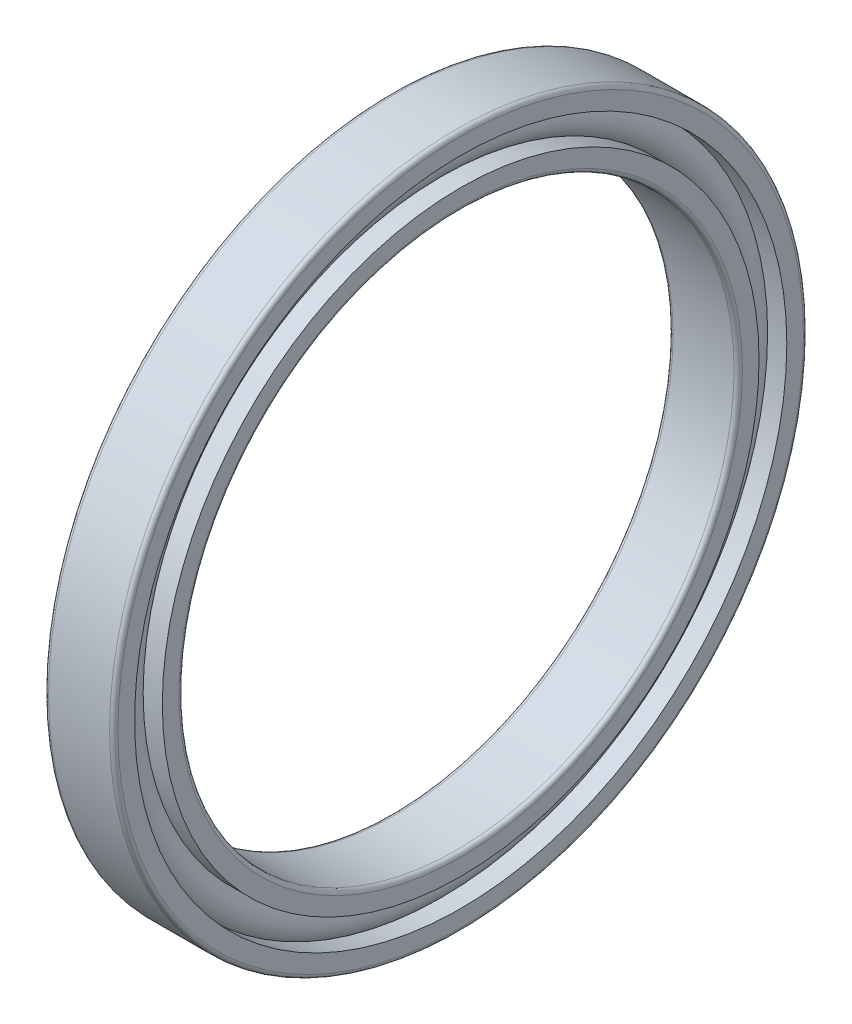
ISO-10303-21;
HEADER;
FILE_DESCRIPTION(('STEP AP214'),'2;1');
FILE_NAME('part.step','',(''),(''),'','','');
FILE_SCHEMA(('AUTOMOTIVE_DESIGN { 1 0 10303 214 1 1 1 1 }'));
ENDSEC;
DATA;
#1=APPLICATION_CONTEXT('core data for automotive mechanical design processes');
#2=APPLICATION_PROTOCOL_DEFINITION('international standard','automotive_design',2000,#1);
#3=PRODUCT_CONTEXT('',#1,'mechanical');
#4=PRODUCT('Part','Part','',(#3));
#5=PRODUCT_RELATED_PRODUCT_CATEGORY('part','',(#4));
#6=PRODUCT_DEFINITION_FORMATION('','',#4);
#7=PRODUCT_DEFINITION_CONTEXT('part definition',#1,'design');
#8=PRODUCT_DEFINITION('design','',#6,#7);
#9=PRODUCT_DEFINITION_SHAPE('','',#8);
#10=(LENGTH_UNIT() NAMED_UNIT(*) SI_UNIT(.MILLI.,.METRE.));
#11=(NAMED_UNIT(*) PLANE_ANGLE_UNIT() SI_UNIT($,.RADIAN.));
#12=(NAMED_UNIT(*) SI_UNIT($,.STERADIAN.) SOLID_ANGLE_UNIT());
#13=UNCERTAINTY_MEASURE_WITH_UNIT(LENGTH_MEASURE(1.E-05),#10,'distance_accuracy_value','');
#14=(GEOMETRIC_REPRESENTATION_CONTEXT(3) GLOBAL_UNCERTAINTY_ASSIGNED_CONTEXT((#13)) GLOBAL_UNIT_ASSIGNED_CONTEXT((#10,
#11,#12)) REPRESENTATION_CONTEXT('',''));
#15=CARTESIAN_POINT('',(0.,0.,0.));
#16=DIRECTION('',(0.,0.,1.));
#17=DIRECTION('',(1.,0.,0.));
#18=AXIS2_PLACEMENT_3D('',#15,#16,#17);
#19=CARTESIAN_POINT('',(0.,0.,0.));
#20=DIRECTION('',(-1.,0.,0.));
#21=DIRECTION('',(0.,0.,1.));
#22=AXIS2_PLACEMENT_3D('',#19,#20,#21);
#23=TOROIDAL_SURFACE('',#22,45.,3.);
#24=CARTESIAN_POINT('',(2.23606797749979,0.,0.));
#25=DIRECTION('',(-1.,0.,0.));
#26=DIRECTION('',(0.,0.,1.));
#27=AXIS2_PLACEMENT_3D('',#24,#25,#26);
#28=CIRCLE('',#27,47.);
#29=CARTESIAN_POINT('',(2.23606797749979,0.,47.));
#30=VERTEX_POINT('',#29);
#31=EDGE_CURVE('E38',#30,#30,#28,.F.);
#32=ORIENTED_EDGE('',*,*,#31,.T.);
#33=EDGE_LOOP('',(#32));
#34=FACE_BOUND('',#33,.T.);
#35=CARTESIAN_POINT('',(2.23606797749979,0.,0.));
#36=DIRECTION('',(-1.,0.,0.));
#37=DIRECTION('',(0.,0.,1.));
#38=AXIS2_PLACEMENT_3D('',#35,#36,#37);
#39=CIRCLE('',#38,43.);
#40=CARTESIAN_POINT('',(2.23606797749979,0.,43.));
#41=VERTEX_POINT('',#40);
#42=EDGE_CURVE('E10',#41,#41,#39,.T.);
#43=ORIENTED_EDGE('',*,*,#42,.T.);
#44=EDGE_LOOP('',(#43));
#45=FACE_BOUND('',#44,.T.);
#46=ADVANCED_FACE('F34',(#34,#45),#23,.T.);
#47=CARTESIAN_POINT('',(-20.6375,0.,0.));
#48=DIRECTION('',(1.,0.,0.));
#49=DIRECTION('',(0.,0.,-1.));
#50=AXIS2_PLACEMENT_3D('',#47,#48,#49);
#51=CYLINDRICAL_SURFACE('',#50,43.);
#52=CARTESIAN_POINT('',(5.,0.,0.));
#53=DIRECTION('',(1.,0.,0.));
#54=DIRECTION('',(0.,0.,-1.));
#55=AXIS2_PLACEMENT_3D('',#52,#53,#54);
#56=CIRCLE('',#55,43.);
#57=CARTESIAN_POINT('',(5.,0.,-43.));
#58=VERTEX_POINT('',#57);
#59=EDGE_CURVE('E47',#58,#58,#56,.T.);
#60=ORIENTED_EDGE('',*,*,#59,.F.);
#61=EDGE_LOOP('',(#60));
#62=FACE_BOUND('',#61,.T.);
#63=ORIENTED_EDGE('',*,*,#42,.F.);
#64=EDGE_LOOP('',(#63));
#65=FACE_BOUND('',#64,.T.);
#66=ADVANCED_FACE('F86',(#62,#65),#51,.T.);
#67=CARTESIAN_POINT('',(-20.6375,0.,0.));
#68=DIRECTION('',(1.,0.,0.));
#69=DIRECTION('',(0.,0.,-1.));
#70=AXIS2_PLACEMENT_3D('',#67,#68,#69);
#71=CYLINDRICAL_SURFACE('',#70,43.);
#72=CARTESIAN_POINT('',(-5.,0.,0.));
#73=DIRECTION('',(1.,0.,0.));
#74=DIRECTION('',(0.,0.,-1.));
#75=AXIS2_PLACEMENT_3D('',#72,#73,#74);
#76=CIRCLE('',#75,43.);
#77=CARTESIAN_POINT('',(-5.,0.,-43.));
#78=VERTEX_POINT('',#77);
#79=EDGE_CURVE('E56',#78,#78,#76,.T.);
#80=ORIENTED_EDGE('',*,*,#79,.T.);
#81=EDGE_LOOP('',(#80));
#82=FACE_BOUND('',#81,.T.);
#83=CARTESIAN_POINT('',(-2.23606797749979,0.,0.));
#84=DIRECTION('',(1.,0.,0.));
#85=DIRECTION('',(0.,0.,-1.));
#86=AXIS2_PLACEMENT_3D('',#83,#84,#85);
#87=CIRCLE('',#86,43.);
#88=CARTESIAN_POINT('',(-2.23606797749979,0.,-43.));
#89=VERTEX_POINT('',#88);
#90=EDGE_CURVE('E42',#89,#89,#87,.T.);
#91=ORIENTED_EDGE('',*,*,#90,.F.);
#92=EDGE_LOOP('',(#91));
#93=FACE_BOUND('',#92,.T.);
#94=ADVANCED_FACE('F89',(#82,#93),#71,.T.);
#95=CARTESIAN_POINT('',(5.,40.6,0.));
#96=DIRECTION('',(1.,0.,0.));
#97=DIRECTION('',(0.,0.,-1.));
#98=AXIS2_PLACEMENT_3D('',#95,#96,#97);
#99=PLANE('',#98);
#100=ORIENTED_EDGE('',*,*,#59,.T.);
#101=EDGE_LOOP('',(#100));
#102=FACE_BOUND('',#101,.T.);
#103=CARTESIAN_POINT('',(5.,0.,0.));
#104=DIRECTION('',(1.,0.,0.));
#105=DIRECTION('',(0.,0.,-1.));
#106=AXIS2_PLACEMENT_3D('',#103,#104,#105);
#107=CIRCLE('',#106,40.6);
#108=CARTESIAN_POINT('',(5.,0.,-40.6));
#109=VERTEX_POINT('',#108);
#110=EDGE_CURVE('E78',#109,#109,#107,.T.);
#111=ORIENTED_EDGE('',*,*,#110,.F.);
#112=EDGE_LOOP('',(#111));
#113=FACE_BOUND('',#112,.T.);
#114=ADVANCED_FACE('F83',(#102,#113),#99,.T.);
#115=CARTESIAN_POINT('',(4.4,0.,0.));
#116=DIRECTION('',(1.,0.,0.));
#117=DIRECTION('',(0.,0.,-1.));
#118=AXIS2_PLACEMENT_3D('',#115,#116,#117);
#119=TOROIDAL_SURFACE('',#118,40.6,0.600000000000002);
#120=ORIENTED_EDGE('',*,*,#110,.T.);
#121=EDGE_LOOP('',(#120));
#122=FACE_BOUND('',#121,.T.);
#123=CARTESIAN_POINT('',(4.4,0.,0.));
#124=DIRECTION('',(1.,0.,0.));
#125=DIRECTION('',(0.,0.,-1.));
#126=AXIS2_PLACEMENT_3D('',#123,#124,#125);
#127=CIRCLE('',#126,40.);
#128=CARTESIAN_POINT('',(4.4,0.,-40.));
#129=VERTEX_POINT('',#128);
#130=EDGE_CURVE('E75',#129,#129,#127,.T.);
#131=ORIENTED_EDGE('',*,*,#130,.F.);
#132=EDGE_LOOP('',(#131));
#133=FACE_BOUND('',#132,.T.);
#134=ADVANCED_FACE('F100',(#122,#133),#119,.T.);
#135=CARTESIAN_POINT('',(-20.6375,0.,0.));
#136=DIRECTION('',(1.,0.,0.));
#137=DIRECTION('',(0.,0.,-1.));
#138=AXIS2_PLACEMENT_3D('',#135,#136,#137);
#139=CYLINDRICAL_SURFACE('',#138,40.);
#140=ORIENTED_EDGE('',*,*,#130,.T.);
#141=EDGE_LOOP('',(#140));
#142=FACE_BOUND('',#141,.T.);
#143=CARTESIAN_POINT('',(-4.4,0.,0.));
#144=DIRECTION('',(1.,0.,0.));
#145=DIRECTION('',(0.,0.,-1.));
#146=AXIS2_PLACEMENT_3D('',#143,#144,#145);
#147=CIRCLE('',#146,40.);
#148=CARTESIAN_POINT('',(-4.4,0.,-40.));
#149=VERTEX_POINT('',#148);
#150=EDGE_CURVE('E72',#149,#149,#147,.T.);
#151=ORIENTED_EDGE('',*,*,#150,.F.);
#152=EDGE_LOOP('',(#151));
#153=FACE_BOUND('',#152,.T.);
#154=ADVANCED_FACE('F103',(#142,#153),#139,.F.);
#155=CARTESIAN_POINT('',(-4.4,0.,0.));
#156=DIRECTION('',(1.,0.,0.));
#157=DIRECTION('',(0.,0.,-1.));
#158=AXIS2_PLACEMENT_3D('',#155,#156,#157);
#159=TOROIDAL_SURFACE('',#158,40.6,0.600000000000002);
#160=ORIENTED_EDGE('',*,*,#150,.T.);
#161=EDGE_LOOP('',(#160));
#162=FACE_BOUND('',#161,.T.);
#163=CARTESIAN_POINT('',(-5.,0.,0.));
#164=DIRECTION('',(1.,0.,0.));
#165=DIRECTION('',(0.,0.,-1.));
#166=AXIS2_PLACEMENT_3D('',#163,#164,#165);
#167=CIRCLE('',#166,40.6);
#168=CARTESIAN_POINT('',(-5.,0.,-40.6));
#169=VERTEX_POINT('',#168);
#170=EDGE_CURVE('E69',#169,#169,#167,.T.);
#171=ORIENTED_EDGE('',*,*,#170,.F.);
#172=EDGE_LOOP('',(#171));
#173=FACE_BOUND('',#172,.T.);
#174=ADVANCED_FACE('F107',(#162,#173),#159,.T.);
#175=CARTESIAN_POINT('',(-5.,43.,0.));
#176=DIRECTION('',(-1.,0.,0.));
#177=DIRECTION('',(0.,0.,1.));
#178=AXIS2_PLACEMENT_3D('',#175,#176,#177);
#179=PLANE('',#178);
#180=ORIENTED_EDGE('',*,*,#170,.T.);
#181=EDGE_LOOP('',(#180));
#182=FACE_BOUND('',#181,.T.);
#183=ORIENTED_EDGE('',*,*,#79,.F.);
#184=EDGE_LOOP('',(#183));
#185=FACE_BOUND('',#184,.T.);
#186=ADVANCED_FACE('F111',(#182,#185),#179,.T.);
#187=CARTESIAN_POINT('',(-2.23606797749979,0.,0.));
#188=DIRECTION('',(1.,0.,0.));
#189=DIRECTION('',(0.,0.,-1.));
#190=AXIS2_PLACEMENT_3D('',#187,#188,#189);
#191=CIRCLE('',#190,47.);
#192=CARTESIAN_POINT('',(-2.23606797749979,0.,-47.));
#193=VERTEX_POINT('',#192);
#194=EDGE_CURVE('E50',#193,#193,#191,.F.);
#195=ORIENTED_EDGE('',*,*,#194,.T.);
#196=EDGE_LOOP('',(#195));
#197=FACE_BOUND('',#196,.T.);
#198=ORIENTED_EDGE('',*,*,#90,.T.);
#199=EDGE_LOOP('',(#198));
#200=FACE_BOUND('',#199,.T.);
#201=ADVANCED_FACE('F36',(#197,#200),#23,.T.);
#202=CARTESIAN_POINT('',(-20.6375,0.,0.));
#203=DIRECTION('',(1.,0.,0.));
#204=DIRECTION('',(0.,0.,-1.));
#205=AXIS2_PLACEMENT_3D('',#202,#203,#204);
#206=CYLINDRICAL_SURFACE('',#205,47.);
#207=CARTESIAN_POINT('',(4.99999999999999,0.,0.));
#208=DIRECTION('',(1.,0.,0.));
#209=DIRECTION('',(0.,0.,-1.));
#210=AXIS2_PLACEMENT_3D('',#207,#208,#209);
#211=CIRCLE('',#210,47.);
#212=CARTESIAN_POINT('',(4.99999999999999,0.,-47.));
#213=VERTEX_POINT('',#212);
#214=EDGE_CURVE('E52',#213,#213,#211,.T.);
#215=ORIENTED_EDGE('',*,*,#214,.T.);
#216=EDGE_LOOP('',(#215));
#217=FACE_BOUND('',#216,.T.);
#218=ORIENTED_EDGE('',*,*,#31,.F.);
#219=EDGE_LOOP('',(#218));
#220=FACE_BOUND('',#219,.T.);
#221=ADVANCED_FACE('F116',(#217,#220),#206,.F.);
#222=CARTESIAN_POINT('',(-20.6375,0.,0.));
#223=DIRECTION('',(1.,0.,0.));
#224=DIRECTION('',(0.,0.,-1.));
#225=AXIS2_PLACEMENT_3D('',#222,#223,#224);
#226=CYLINDRICAL_SURFACE('',#225,47.);
#227=CARTESIAN_POINT('',(-4.99999999999999,0.,0.));
#228=DIRECTION('',(1.,0.,0.));
#229=DIRECTION('',(0.,0.,-1.));
#230=AXIS2_PLACEMENT_3D('',#227,#228,#229);
#231=CIRCLE('',#230,47.);
#232=CARTESIAN_POINT('',(-4.99999999999999,0.,-47.));
#233=VERTEX_POINT('',#232);
#234=EDGE_CURVE('E147',#233,#233,#231,.T.);
#235=ORIENTED_EDGE('',*,*,#234,.F.);
#236=EDGE_LOOP('',(#235));
#237=FACE_BOUND('',#236,.T.);
#238=ORIENTED_EDGE('',*,*,#194,.F.);
#239=EDGE_LOOP('',(#238));
#240=FACE_BOUND('',#239,.T.);
#241=ADVANCED_FACE('F119',(#237,#240),#226,.F.);
#242=CARTESIAN_POINT('',(4.99999999999999,49.4,0.));
#243=DIRECTION('',(1.,0.,0.));
#244=DIRECTION('',(0.,0.,-1.));
#245=AXIS2_PLACEMENT_3D('',#242,#243,#244);
#246=PLANE('',#245);
#247=CARTESIAN_POINT('',(4.99999999999999,0.,0.));
#248=DIRECTION('',(1.,0.,0.));
#249=DIRECTION('',(0.,0.,-1.));
#250=AXIS2_PLACEMENT_3D('',#247,#248,#249);
#251=CIRCLE('',#250,49.4);
#252=CARTESIAN_POINT('',(4.99999999999999,0.,-49.4));
#253=VERTEX_POINT('',#252);
#254=EDGE_CURVE('E58',#253,#253,#251,.T.);
#255=ORIENTED_EDGE('',*,*,#254,.T.);
#256=EDGE_LOOP('',(#255));
#257=FACE_BOUND('',#256,.T.);
#258=ORIENTED_EDGE('',*,*,#214,.F.);
#259=EDGE_LOOP('',(#258));
#260=FACE_BOUND('',#259,.T.);
#261=ADVANCED_FACE('F120',(#257,#260),#246,.T.);
#262=CARTESIAN_POINT('',(4.39999999999999,0.,0.));
#263=DIRECTION('',(1.,0.,0.));
#264=DIRECTION('',(0.,0.,-1.));
#265=AXIS2_PLACEMENT_3D('',#262,#263,#264);
#266=TOROIDAL_SURFACE('',#265,49.4,0.600000000000002);
#267=CARTESIAN_POINT('',(4.39999999999999,0.,0.));
#268=DIRECTION('',(1.,0.,0.));
#269=DIRECTION('',(0.,0.,-1.));
#270=AXIS2_PLACEMENT_3D('',#267,#268,#269);
#271=CIRCLE('',#270,50.);
#272=CARTESIAN_POINT('',(4.39999999999999,0.,-50.));
#273=VERTEX_POINT('',#272);
#274=EDGE_CURVE('E63',#273,#273,#271,.T.);
#275=ORIENTED_EDGE('',*,*,#274,.T.);
#276=EDGE_LOOP('',(#275));
#277=FACE_BOUND('',#276,.T.);
#278=ORIENTED_EDGE('',*,*,#254,.F.);
#279=EDGE_LOOP('',(#278));
#280=FACE_BOUND('',#279,.T.);
#281=ADVANCED_FACE('F123',(#277,#280),#266,.T.);
#282=CARTESIAN_POINT('',(-20.6375,0.,0.));
#283=DIRECTION('',(1.,0.,0.));
#284=DIRECTION('',(0.,0.,-1.));
#285=AXIS2_PLACEMENT_3D('',#282,#283,#284);
#286=CYLINDRICAL_SURFACE('',#285,50.);
#287=CARTESIAN_POINT('',(-4.39999999999999,0.,0.));
#288=DIRECTION('',(1.,0.,0.));
#289=DIRECTION('',(0.,0.,-1.));
#290=AXIS2_PLACEMENT_3D('',#287,#288,#289);
#291=CIRCLE('',#290,50.);
#292=CARTESIAN_POINT('',(-4.39999999999999,0.,-50.));
#293=VERTEX_POINT('',#292);
#294=EDGE_CURVE('E151',#293,#293,#291,.T.);
#295=ORIENTED_EDGE('',*,*,#294,.T.);
#296=EDGE_LOOP('',(#295));
#297=FACE_BOUND('',#296,.T.);
#298=ORIENTED_EDGE('',*,*,#274,.F.);
#299=EDGE_LOOP('',(#298));
#300=FACE_BOUND('',#299,.T.);
#301=ADVANCED_FACE('F127',(#297,#300),#286,.T.);
#302=CARTESIAN_POINT('',(-4.39999999999999,0.,0.));
#303=DIRECTION('',(1.,0.,0.));
#304=DIRECTION('',(0.,0.,-1.));
#305=AXIS2_PLACEMENT_3D('',#302,#303,#304);
#306=TOROIDAL_SURFACE('',#305,49.4,0.600000000000002);
#307=CARTESIAN_POINT('',(-4.99999999999999,0.,0.));
#308=DIRECTION('',(1.,0.,0.));
#309=DIRECTION('',(0.,0.,-1.));
#310=AXIS2_PLACEMENT_3D('',#307,#308,#309);
#311=CIRCLE('',#310,49.4);
#312=CARTESIAN_POINT('',(-4.99999999999999,0.,-49.4));
#313=VERTEX_POINT('',#312);
#314=EDGE_CURVE('E148',#313,#313,#311,.T.);
#315=ORIENTED_EDGE('',*,*,#314,.T.);
#316=EDGE_LOOP('',(#315));
#317=FACE_BOUND('',#316,.T.);
#318=ORIENTED_EDGE('',*,*,#294,.F.);
#319=EDGE_LOOP('',(#318));
#320=FACE_BOUND('',#319,.T.);
#321=ADVANCED_FACE('F131',(#317,#320),#306,.T.);
#322=CARTESIAN_POINT('',(-4.99999999999999,47.,0.));
#323=DIRECTION('',(-1.,0.,0.));
#324=DIRECTION('',(0.,0.,1.));
#325=AXIS2_PLACEMENT_3D('',#322,#323,#324);
#326=PLANE('',#325);
#327=ORIENTED_EDGE('',*,*,#234,.T.);
#328=EDGE_LOOP('',(#327));
#329=FACE_BOUND('',#328,.T.);
#330=ORIENTED_EDGE('',*,*,#314,.F.);
#331=EDGE_LOOP('',(#330));
#332=FACE_BOUND('',#331,.T.);
#333=ADVANCED_FACE('F135',(#329,#332),#326,.T.);
#334=CLOSED_SHELL('',(#46,#66,#94,#114,#134,#154,#174,#186,#201,#221,#241,#261,#281,#301,#321,#333));
#335=MANIFOLD_SOLID_BREP('B2',#334);
#336=ADVANCED_BREP_SHAPE_REPRESENTATION('',(#18,#335),#14);
#337=SHAPE_DEFINITION_REPRESENTATION(#9,#336);
ENDSEC;
END-ISO-10303-21;
